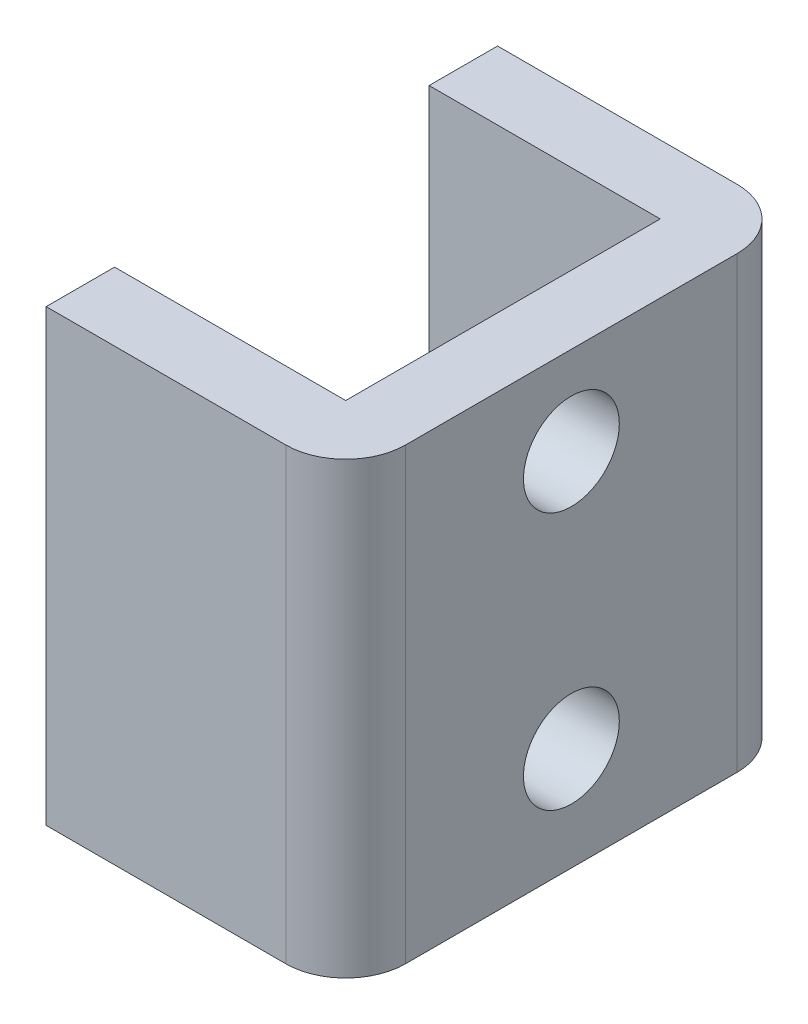
ISO-10303-21;
HEADER;
FILE_DESCRIPTION(('STEP AP214'),'2;1');
FILE_NAME('part.step','',(''),(''),'','','');
FILE_SCHEMA(('AUTOMOTIVE_DESIGN { 1 0 10303 214 1 1 1 1 }'));
ENDSEC;
DATA;
#1=APPLICATION_CONTEXT('core data for automotive mechanical design processes');
#2=APPLICATION_PROTOCOL_DEFINITION('international standard','automotive_design',2000,#1);
#3=PRODUCT_CONTEXT('',#1,'mechanical');
#4=PRODUCT('Part','Part','',(#3));
#5=PRODUCT_RELATED_PRODUCT_CATEGORY('part','',(#4));
#6=PRODUCT_DEFINITION_FORMATION('','',#4);
#7=PRODUCT_DEFINITION_CONTEXT('part definition',#1,'design');
#8=PRODUCT_DEFINITION('design','',#6,#7);
#9=PRODUCT_DEFINITION_SHAPE('','',#8);
#10=(LENGTH_UNIT() NAMED_UNIT(*) SI_UNIT(.MILLI.,.METRE.));
#11=(NAMED_UNIT(*) PLANE_ANGLE_UNIT() SI_UNIT($,.RADIAN.));
#12=(NAMED_UNIT(*) SI_UNIT($,.STERADIAN.) SOLID_ANGLE_UNIT());
#13=UNCERTAINTY_MEASURE_WITH_UNIT(LENGTH_MEASURE(1.E-05),#10,'distance_accuracy_value','');
#14=(GEOMETRIC_REPRESENTATION_CONTEXT(3) GLOBAL_UNCERTAINTY_ASSIGNED_CONTEXT((#13)) GLOBAL_UNIT_ASSIGNED_CONTEXT((#10,
#11,#12)) REPRESENTATION_CONTEXT('',''));
#15=CARTESIAN_POINT('',(0.,0.,0.));
#16=DIRECTION('',(0.,0.,1.));
#17=DIRECTION('',(1.,0.,0.));
#18=AXIS2_PLACEMENT_3D('',#15,#16,#17);
#19=CARTESIAN_POINT('',(-35.941253920068,15.,-35.7928941984103));
#20=DIRECTION('',(1.,0.,0.));
#21=DIRECTION('',(0.,0.,-1.));
#22=AXIS2_PLACEMENT_3D('',#19,#20,#21);
#23=PLANE('',#22);
#24=DIRECTION('',(0.,0.,1.));
#25=VECTOR('',#24,1.);
#26=CARTESIAN_POINT('',(-35.941253920068,15.,-35.7928941984103));
#27=LINE('',#26,#25);
#28=CARTESIAN_POINT('',(-35.941253920068,15.,-23.0078941984103));
#29=VERTEX_POINT('',#28);
#30=CARTESIAN_POINT('',(-35.941253920068,15.,-20.7228941984103));
#31=VERTEX_POINT('',#30);
#32=EDGE_CURVE('E223',#29,#31,#27,.T.);
#33=ORIENTED_EDGE('',*,*,#32,.F.);
#34=DIRECTION('',(0.,1.,0.));
#35=VECTOR('',#34,1.);
#36=CARTESIAN_POINT('',(-35.941253920068,0.,-23.0078941984103));
#37=LINE('',#36,#35);
#38=CARTESIAN_POINT('',(-35.941253920068,0.,-23.0078941984103));
#39=VERTEX_POINT('',#38);
#40=EDGE_CURVE('E137',#39,#29,#37,.T.);
#41=ORIENTED_EDGE('',*,*,#40,.F.);
#42=DIRECTION('',(0.,0.,1.));
#43=VECTOR('',#42,1.);
#44=CARTESIAN_POINT('',(-35.941253920068,0.,-35.7928941984103));
#45=LINE('',#44,#43);
#46=CARTESIAN_POINT('',(-35.941253920068,0.,-20.7228941984103));
#47=VERTEX_POINT('',#46);
#48=EDGE_CURVE('E144',#39,#47,#45,.T.);
#49=ORIENTED_EDGE('',*,*,#48,.T.);
#50=DIRECTION('',(0.,-1.,0.));
#51=VECTOR('',#50,1.);
#52=CARTESIAN_POINT('',(-35.941253920068,15.,-20.7228941984103));
#53=LINE('',#52,#51);
#54=EDGE_CURVE('E49',#31,#47,#53,.T.);
#55=ORIENTED_EDGE('',*,*,#54,.F.);
#56=EDGE_LOOP('',(#33,#41,#49,#55));
#57=FACE_BOUND('',#56,.T.);
#58=ADVANCED_FACE('F39',(#57),#23,.F.);
#59=CARTESIAN_POINT('',(-35.941253920068,15.,-35.7928941984103));
#60=DIRECTION('',(0.,0.,1.));
#61=DIRECTION('',(1.,0.,0.));
#62=AXIS2_PLACEMENT_3D('',#59,#60,#61);
#63=PLANE('',#62);
#64=DIRECTION('',(-1.,0.,0.));
#65=VECTOR('',#64,1.);
#66=CARTESIAN_POINT('',(-35.941253920068,0.,-35.7928941984103));
#67=LINE('',#66,#65);
#68=CARTESIAN_POINT('',(-27.941253920068,0.,-35.7928941984103));
#69=VERTEX_POINT('',#68);
#70=CARTESIAN_POINT('',(-35.941253920068,0.,-35.7928941984103));
#71=VERTEX_POINT('',#70);
#72=EDGE_CURVE('E150',#69,#71,#67,.T.);
#73=ORIENTED_EDGE('',*,*,#72,.T.);
#74=DIRECTION('',(0.,-1.,0.));
#75=VECTOR('',#74,1.);
#76=CARTESIAN_POINT('',(-35.941253920068,15.,-35.7928941984103));
#77=LINE('',#76,#75);
#78=CARTESIAN_POINT('',(-35.941253920068,15.,-35.7928941984103));
#79=VERTEX_POINT('',#78);
#80=EDGE_CURVE('E11',#79,#71,#77,.T.);
#81=ORIENTED_EDGE('',*,*,#80,.F.);
#82=DIRECTION('',(-1.,0.,0.));
#83=VECTOR('',#82,1.);
#84=CARTESIAN_POINT('',(-35.941253920068,15.,-35.7928941984103));
#85=LINE('',#84,#83);
#86=CARTESIAN_POINT('',(-27.941253920068,15.,-35.7928941984103));
#87=VERTEX_POINT('',#86);
#88=EDGE_CURVE('E162',#87,#79,#85,.T.);
#89=ORIENTED_EDGE('',*,*,#88,.F.);
#90=DIRECTION('',(0.,-1.,0.));
#91=VECTOR('',#90,1.);
#92=CARTESIAN_POINT('',(-27.941253920068,15.,-35.7928941984103));
#93=LINE('',#92,#91);
#94=EDGE_CURVE('E163',#87,#69,#93,.T.);
#95=ORIENTED_EDGE('',*,*,#94,.T.);
#96=EDGE_LOOP('',(#73,#81,#89,#95));
#97=FACE_BOUND('',#96,.T.);
#98=ADVANCED_FACE('F41',(#97),#63,.F.);
#99=CARTESIAN_POINT('',(-35.941253920068,0.,-33.5078941984103));
#100=VERTEX_POINT('',#99);
#101=EDGE_CURVE('E122',#71,#100,#45,.T.);
#102=ORIENTED_EDGE('',*,*,#101,.T.);
#103=DIRECTION('',(0.,1.,0.));
#104=VECTOR('',#103,1.);
#105=CARTESIAN_POINT('',(-35.941253920068,0.,-33.5078941984103));
#106=LINE('',#105,#104);
#107=CARTESIAN_POINT('',(-35.941253920068,15.,-33.5078941984103));
#108=VERTEX_POINT('',#107);
#109=EDGE_CURVE('E130',#100,#108,#106,.T.);
#110=ORIENTED_EDGE('',*,*,#109,.T.);
#111=EDGE_CURVE('E224',#79,#108,#27,.T.);
#112=ORIENTED_EDGE('',*,*,#111,.F.);
#113=ORIENTED_EDGE('',*,*,#80,.T.);
#114=EDGE_LOOP('',(#102,#110,#112,#113));
#115=FACE_BOUND('',#114,.T.);
#116=ADVANCED_FACE('F139',(#115),#23,.F.);
#117=CARTESIAN_POINT('',(-35.941253920068,15.,-20.7228941984103));
#118=DIRECTION('',(0.,0.,-1.));
#119=DIRECTION('',(-1.,0.,0.));
#120=AXIS2_PLACEMENT_3D('',#117,#118,#119);
#121=PLANE('',#120);
#122=DIRECTION('',(1.,0.,0.));
#123=VECTOR('',#122,1.);
#124=CARTESIAN_POINT('',(-35.941253920068,0.,-20.7228941984103));
#125=LINE('',#124,#123);
#126=CARTESIAN_POINT('',(-27.941253920068,0.,-20.7228941984103));
#127=VERTEX_POINT('',#126);
#128=EDGE_CURVE('E143',#47,#127,#125,.T.);
#129=ORIENTED_EDGE('',*,*,#128,.T.);
#130=DIRECTION('',(0.,-1.,0.));
#131=VECTOR('',#130,1.);
#132=CARTESIAN_POINT('',(-27.941253920068,15.,-20.7228941984103));
#133=LINE('',#132,#131);
#134=CARTESIAN_POINT('',(-27.941253920068,15.,-20.7228941984103));
#135=VERTEX_POINT('',#134);
#136=EDGE_CURVE('E176',#135,#127,#133,.T.);
#137=ORIENTED_EDGE('',*,*,#136,.F.);
#138=DIRECTION('',(1.,0.,0.));
#139=VECTOR('',#138,1.);
#140=CARTESIAN_POINT('',(-35.941253920068,15.,-20.7228941984103));
#141=LINE('',#140,#139);
#142=EDGE_CURVE('E227',#31,#135,#141,.T.);
#143=ORIENTED_EDGE('',*,*,#142,.F.);
#144=ORIENTED_EDGE('',*,*,#54,.T.);
#145=EDGE_LOOP('',(#129,#137,#143,#144));
#146=FACE_BOUND('',#145,.T.);
#147=ADVANCED_FACE('F260',(#146),#121,.F.);
#148=CARTESIAN_POINT('',(-27.941253920068,15.,-22.7228941984103));
#149=DIRECTION('',(0.,-1.,0.));
#150=DIRECTION('',(0.,0.,-1.));
#151=AXIS2_PLACEMENT_3D('',#148,#149,#150);
#152=CYLINDRICAL_SURFACE('',#151,2.);
#153=CARTESIAN_POINT('',(-27.941253920068,0.,-22.7228941984103));
#154=DIRECTION('',(0.,1.,0.));
#155=DIRECTION('',(0.,0.,1.));
#156=AXIS2_PLACEMENT_3D('',#153,#154,#155);
#157=CIRCLE('',#156,2.);
#158=CARTESIAN_POINT('',(-25.941253920068,0.,-22.7228941984103));
#159=VERTEX_POINT('',#158);
#160=EDGE_CURVE('E148',#127,#159,#157,.T.);
#161=ORIENTED_EDGE('',*,*,#160,.T.);
#162=DIRECTION('',(0.,-1.,0.));
#163=VECTOR('',#162,1.);
#164=CARTESIAN_POINT('',(-25.941253920068,15.,-22.7228941984103));
#165=LINE('',#164,#163);
#166=CARTESIAN_POINT('',(-25.941253920068,15.,-22.7228941984103));
#167=VERTEX_POINT('',#166);
#168=EDGE_CURVE('E172',#167,#159,#165,.T.);
#169=ORIENTED_EDGE('',*,*,#168,.F.);
#170=CARTESIAN_POINT('',(-27.941253920068,15.,-22.7228941984103));
#171=DIRECTION('',(0.,1.,0.));
#172=DIRECTION('',(0.,0.,1.));
#173=AXIS2_PLACEMENT_3D('',#170,#171,#172);
#174=CIRCLE('',#173,2.);
#175=EDGE_CURVE('E230',#135,#167,#174,.T.);
#176=ORIENTED_EDGE('',*,*,#175,.F.);
#177=ORIENTED_EDGE('',*,*,#136,.T.);
#178=EDGE_LOOP('',(#161,#169,#176,#177));
#179=FACE_BOUND('',#178,.T.);
#180=ADVANCED_FACE('F256',(#179),#152,.T.);
#181=CARTESIAN_POINT('',(-25.941253920068,15.,-33.7928941984103));
#182=DIRECTION('',(-1.,0.,0.));
#183=DIRECTION('',(0.,0.,1.));
#184=AXIS2_PLACEMENT_3D('',#181,#182,#183);
#185=PLANE('',#184);
#186=CARTESIAN_POINT('',(-25.941253920068,12.049892986036,-28.2578941984103));
#187=DIRECTION('',(1.,0.,0.));
#188=DIRECTION('',(0.,0.,-1.));
#189=AXIS2_PLACEMENT_3D('',#186,#187,#188);
#190=CIRCLE('',#189,1.6);
#191=CARTESIAN_POINT('',(-25.941253920068,12.049892986036,-29.8578941984103));
#192=VERTEX_POINT('',#191);
#193=EDGE_CURVE('E185',#192,#192,#190,.T.);
#194=ORIENTED_EDGE('',*,*,#193,.F.);
#195=EDGE_LOOP('',(#194));
#196=FACE_BOUND('',#195,.T.);
#197=CARTESIAN_POINT('',(-25.941253920068,3.44989298603597,-28.2578941984103));
#198=DIRECTION('',(1.,0.,0.));
#199=DIRECTION('',(0.,0.,-1.));
#200=AXIS2_PLACEMENT_3D('',#197,#198,#199);
#201=CIRCLE('',#200,1.6);
#202=CARTESIAN_POINT('',(-25.941253920068,3.44989298603597,-29.8578941984103));
#203=VERTEX_POINT('',#202);
#204=EDGE_CURVE('E192',#203,#203,#201,.T.);
#205=ORIENTED_EDGE('',*,*,#204,.F.);
#206=EDGE_LOOP('',(#205));
#207=FACE_BOUND('',#206,.T.);
#208=DIRECTION('',(0.,0.,-1.));
#209=VECTOR('',#208,1.);
#210=CARTESIAN_POINT('',(-25.941253920068,0.,-33.7928941984103));
#211=LINE('',#210,#209);
#212=CARTESIAN_POINT('',(-25.941253920068,0.,-33.7928941984103));
#213=VERTEX_POINT('',#212);
#214=EDGE_CURVE('E156',#159,#213,#211,.T.);
#215=ORIENTED_EDGE('',*,*,#214,.T.);
#216=DIRECTION('',(0.,-1.,0.));
#217=VECTOR('',#216,1.);
#218=CARTESIAN_POINT('',(-25.941253920068,15.,-33.7928941984103));
#219=LINE('',#218,#217);
#220=CARTESIAN_POINT('',(-25.941253920068,15.,-33.7928941984103));
#221=VERTEX_POINT('',#220);
#222=EDGE_CURVE('E167',#221,#213,#219,.T.);
#223=ORIENTED_EDGE('',*,*,#222,.F.);
#224=DIRECTION('',(0.,0.,-1.));
#225=VECTOR('',#224,1.);
#226=CARTESIAN_POINT('',(-25.941253920068,15.,-33.7928941984103));
#227=LINE('',#226,#225);
#228=EDGE_CURVE('E233',#167,#221,#227,.T.);
#229=ORIENTED_EDGE('',*,*,#228,.F.);
#230=ORIENTED_EDGE('',*,*,#168,.T.);
#231=EDGE_LOOP('',(#215,#223,#229,#230));
#232=FACE_BOUND('',#231,.T.);
#233=ADVANCED_FACE('F252',(#196,#207,#232),#185,.F.);
#234=CARTESIAN_POINT('',(-27.941253920068,15.,-33.7928941984103));
#235=DIRECTION('',(0.,-1.,0.));
#236=DIRECTION('',(0.,0.,-1.));
#237=AXIS2_PLACEMENT_3D('',#234,#235,#236);
#238=CYLINDRICAL_SURFACE('',#237,2.);
#239=CARTESIAN_POINT('',(-27.941253920068,0.,-33.7928941984103));
#240=DIRECTION('',(0.,1.,0.));
#241=DIRECTION('',(0.,0.,-1.));
#242=AXIS2_PLACEMENT_3D('',#239,#240,#241);
#243=CIRCLE('',#242,2.);
#244=EDGE_CURVE('E159',#213,#69,#243,.T.);
#245=ORIENTED_EDGE('',*,*,#244,.T.);
#246=ORIENTED_EDGE('',*,*,#94,.F.);
#247=CARTESIAN_POINT('',(-27.941253920068,15.,-33.7928941984103));
#248=DIRECTION('',(0.,1.,0.));
#249=DIRECTION('',(0.,0.,-1.));
#250=AXIS2_PLACEMENT_3D('',#247,#248,#249);
#251=CIRCLE('',#250,2.);
#252=EDGE_CURVE('E168',#221,#87,#251,.T.);
#253=ORIENTED_EDGE('',*,*,#252,.F.);
#254=ORIENTED_EDGE('',*,*,#222,.T.);
#255=EDGE_LOOP('',(#245,#246,#253,#254));
#256=FACE_BOUND('',#255,.T.);
#257=ADVANCED_FACE('F244',(#256),#238,.T.);
#258=CARTESIAN_POINT('',(-27.941253920068,15.,-33.7928941984103));
#259=DIRECTION('',(0.,-1.,0.));
#260=DIRECTION('',(0.,0.,-1.));
#261=AXIS2_PLACEMENT_3D('',#258,#259,#260);
#262=PLANE('',#261);
#263=DIRECTION('',(1.,0.,0.));
#264=VECTOR('',#263,1.);
#265=CARTESIAN_POINT('',(0.,15.,-23.0078941984103));
#266=LINE('',#265,#264);
#267=CARTESIAN_POINT('',(-28.226253920068,15.,-23.0078941984103));
#268=VERTEX_POINT('',#267);
#269=EDGE_CURVE('E57',#29,#268,#266,.T.);
#270=ORIENTED_EDGE('',*,*,#269,.F.);
#271=ORIENTED_EDGE('',*,*,#32,.T.);
#272=ORIENTED_EDGE('',*,*,#142,.T.);
#273=ORIENTED_EDGE('',*,*,#175,.T.);
#274=ORIENTED_EDGE('',*,*,#228,.T.);
#275=ORIENTED_EDGE('',*,*,#252,.T.);
#276=ORIENTED_EDGE('',*,*,#88,.T.);
#277=ORIENTED_EDGE('',*,*,#111,.T.);
#278=DIRECTION('',(-1.,0.,0.));
#279=VECTOR('',#278,1.);
#280=CARTESIAN_POINT('',(0.,15.,-33.5078941984103));
#281=LINE('',#280,#279);
#282=CARTESIAN_POINT('',(-28.226253920068,15.,-33.5078941984103));
#283=VERTEX_POINT('',#282);
#284=EDGE_CURVE('E133',#283,#108,#281,.T.);
#285=ORIENTED_EDGE('',*,*,#284,.F.);
#286=DIRECTION('',(0.,0.,-1.));
#287=VECTOR('',#286,1.);
#288=CARTESIAN_POINT('',(-28.226253920068,15.,0.));
#289=LINE('',#288,#287);
#290=EDGE_CURVE('E209',#268,#283,#289,.T.);
#291=ORIENTED_EDGE('',*,*,#290,.F.);
#292=EDGE_LOOP('',(#270,#271,#272,#273,#274,#275,#276,#277,#285,#291));
#293=FACE_BOUND('',#292,.T.);
#294=ADVANCED_FACE('F239',(#293),#262,.F.);
#295=CARTESIAN_POINT('',(-27.941253920068,0.,-33.7928941984103));
#296=DIRECTION('',(0.,-1.,0.));
#297=DIRECTION('',(0.,0.,-1.));
#298=AXIS2_PLACEMENT_3D('',#295,#296,#297);
#299=PLANE('',#298);
#300=ORIENTED_EDGE('',*,*,#48,.F.);
#301=DIRECTION('',(1.,0.,0.));
#302=VECTOR('',#301,1.);
#303=CARTESIAN_POINT('',(0.,0.,-23.0078941984103));
#304=LINE('',#303,#302);
#305=CARTESIAN_POINT('',(-28.226253920068,0.,-23.0078941984103));
#306=VERTEX_POINT('',#305);
#307=EDGE_CURVE('E202',#39,#306,#304,.T.);
#308=ORIENTED_EDGE('',*,*,#307,.T.);
#309=DIRECTION('',(0.,0.,-1.));
#310=VECTOR('',#309,1.);
#311=CARTESIAN_POINT('',(-28.226253920068,0.,0.));
#312=LINE('',#311,#310);
#313=CARTESIAN_POINT('',(-28.226253920068,0.,-33.5078941984103));
#314=VERTEX_POINT('',#313);
#315=EDGE_CURVE('E125',#306,#314,#312,.T.);
#316=ORIENTED_EDGE('',*,*,#315,.T.);
#317=DIRECTION('',(-1.,0.,0.));
#318=VECTOR('',#317,1.);
#319=CARTESIAN_POINT('',(0.,0.,-33.5078941984103));
#320=LINE('',#319,#318);
#321=EDGE_CURVE('E65',#314,#100,#320,.T.);
#322=ORIENTED_EDGE('',*,*,#321,.T.);
#323=ORIENTED_EDGE('',*,*,#101,.F.);
#324=ORIENTED_EDGE('',*,*,#72,.F.);
#325=ORIENTED_EDGE('',*,*,#244,.F.);
#326=ORIENTED_EDGE('',*,*,#214,.F.);
#327=ORIENTED_EDGE('',*,*,#160,.F.);
#328=ORIENTED_EDGE('',*,*,#128,.F.);
#329=EDGE_LOOP('',(#300,#308,#316,#322,#323,#324,#325,#326,#327,#328));
#330=FACE_BOUND('',#329,.T.);
#331=ADVANCED_FACE('F119',(#330),#299,.T.);
#332=CARTESIAN_POINT('',(0.,0.,-23.0078941984103));
#333=DIRECTION('',(0.,0.,1.));
#334=DIRECTION('',(1.,0.,0.));
#335=AXIS2_PLACEMENT_3D('',#332,#333,#334);
#336=PLANE('',#335);
#337=ORIENTED_EDGE('',*,*,#269,.T.);
#338=DIRECTION('',(0.,1.,0.));
#339=VECTOR('',#338,1.);
#340=CARTESIAN_POINT('',(-28.226253920068,0.,-23.0078941984103));
#341=LINE('',#340,#339);
#342=EDGE_CURVE('E127',#306,#268,#341,.T.);
#343=ORIENTED_EDGE('',*,*,#342,.F.);
#344=ORIENTED_EDGE('',*,*,#307,.F.);
#345=ORIENTED_EDGE('',*,*,#40,.T.);
#346=EDGE_LOOP('',(#337,#343,#344,#345));
#347=FACE_BOUND('',#346,.T.);
#348=ADVANCED_FACE('F265',(#347),#336,.F.);
#349=CARTESIAN_POINT('',(0.,0.,-33.5078941984103));
#350=DIRECTION('',(0.,0.,-1.));
#351=DIRECTION('',(-1.,0.,0.));
#352=AXIS2_PLACEMENT_3D('',#349,#350,#351);
#353=PLANE('',#352);
#354=ORIENTED_EDGE('',*,*,#284,.T.);
#355=ORIENTED_EDGE('',*,*,#109,.F.);
#356=ORIENTED_EDGE('',*,*,#321,.F.);
#357=DIRECTION('',(0.,1.,0.));
#358=VECTOR('',#357,1.);
#359=CARTESIAN_POINT('',(-28.226253920068,0.,-33.5078941984103));
#360=LINE('',#359,#358);
#361=EDGE_CURVE('E215',#314,#283,#360,.T.);
#362=ORIENTED_EDGE('',*,*,#361,.T.);
#363=EDGE_LOOP('',(#354,#355,#356,#362));
#364=FACE_BOUND('',#363,.T.);
#365=ADVANCED_FACE('F131',(#364),#353,.F.);
#366=CARTESIAN_POINT('',(-28.226253920068,0.,0.));
#367=DIRECTION('',(1.,0.,0.));
#368=DIRECTION('',(0.,0.,-1.));
#369=AXIS2_PLACEMENT_3D('',#366,#367,#368);
#370=PLANE('',#369);
#371=CARTESIAN_POINT('',(-28.226253920068,12.049892986036,-28.2578941984103));
#372=DIRECTION('',(1.,0.,0.));
#373=DIRECTION('',(0.,0.,-1.));
#374=AXIS2_PLACEMENT_3D('',#371,#372,#373);
#375=CIRCLE('',#374,1.6);
#376=CARTESIAN_POINT('',(-28.226253920068,12.049892986036,-29.8578941984103));
#377=VERTEX_POINT('',#376);
#378=EDGE_CURVE('E43',#377,#377,#375,.T.);
#379=ORIENTED_EDGE('',*,*,#378,.T.);
#380=EDGE_LOOP('',(#379));
#381=FACE_BOUND('',#380,.T.);
#382=CARTESIAN_POINT('',(-28.226253920068,3.44989298603597,-28.2578941984103));
#383=DIRECTION('',(1.,0.,0.));
#384=DIRECTION('',(0.,0.,-1.));
#385=AXIS2_PLACEMENT_3D('',#382,#383,#384);
#386=CIRCLE('',#385,1.6);
#387=CARTESIAN_POINT('',(-28.226253920068,3.44989298603597,-29.8578941984103));
#388=VERTEX_POINT('',#387);
#389=EDGE_CURVE('E182',#388,#388,#386,.T.);
#390=ORIENTED_EDGE('',*,*,#389,.T.);
#391=EDGE_LOOP('',(#390));
#392=FACE_BOUND('',#391,.T.);
#393=ORIENTED_EDGE('',*,*,#290,.T.);
#394=ORIENTED_EDGE('',*,*,#361,.F.);
#395=ORIENTED_EDGE('',*,*,#315,.F.);
#396=ORIENTED_EDGE('',*,*,#342,.T.);
#397=EDGE_LOOP('',(#393,#394,#395,#396));
#398=FACE_BOUND('',#397,.T.);
#399=ADVANCED_FACE('F268',(#381,#392,#398),#370,.F.);
#400=CARTESIAN_POINT('',(-35.941253920068,3.44989298603597,-28.2578941984103));
#401=DIRECTION('',(1.,0.,0.));
#402=DIRECTION('',(0.,0.,-1.));
#403=AXIS2_PLACEMENT_3D('',#400,#401,#402);
#404=CYLINDRICAL_SURFACE('',#403,1.6);
#405=ORIENTED_EDGE('',*,*,#204,.T.);
#406=EDGE_LOOP('',(#405));
#407=FACE_BOUND('',#406,.T.);
#408=ORIENTED_EDGE('',*,*,#389,.F.);
#409=EDGE_LOOP('',(#408));
#410=FACE_BOUND('',#409,.T.);
#411=ADVANCED_FACE('F271',(#407,#410),#404,.F.);
#412=CARTESIAN_POINT('',(-35.941253920068,12.049892986036,-28.2578941984103));
#413=DIRECTION('',(1.,0.,0.));
#414=DIRECTION('',(0.,0.,-1.));
#415=AXIS2_PLACEMENT_3D('',#412,#413,#414);
#416=CYLINDRICAL_SURFACE('',#415,1.6);
#417=ORIENTED_EDGE('',*,*,#193,.T.);
#418=EDGE_LOOP('',(#417));
#419=FACE_BOUND('',#418,.T.);
#420=ORIENTED_EDGE('',*,*,#378,.F.);
#421=EDGE_LOOP('',(#420));
#422=FACE_BOUND('',#421,.T.);
#423=ADVANCED_FACE('F278',(#419,#422),#416,.F.);
#424=CLOSED_SHELL('',(#58,#98,#116,#147,#180,#233,#257,#294,#331,#348,#365,#399,#411,#423));
#425=MANIFOLD_SOLID_BREP('B2',#424);
#426=ADVANCED_BREP_SHAPE_REPRESENTATION('',(#18,#425),#14);
#427=SHAPE_DEFINITION_REPRESENTATION(#9,#426);
ENDSEC;
END-ISO-10303-21;
